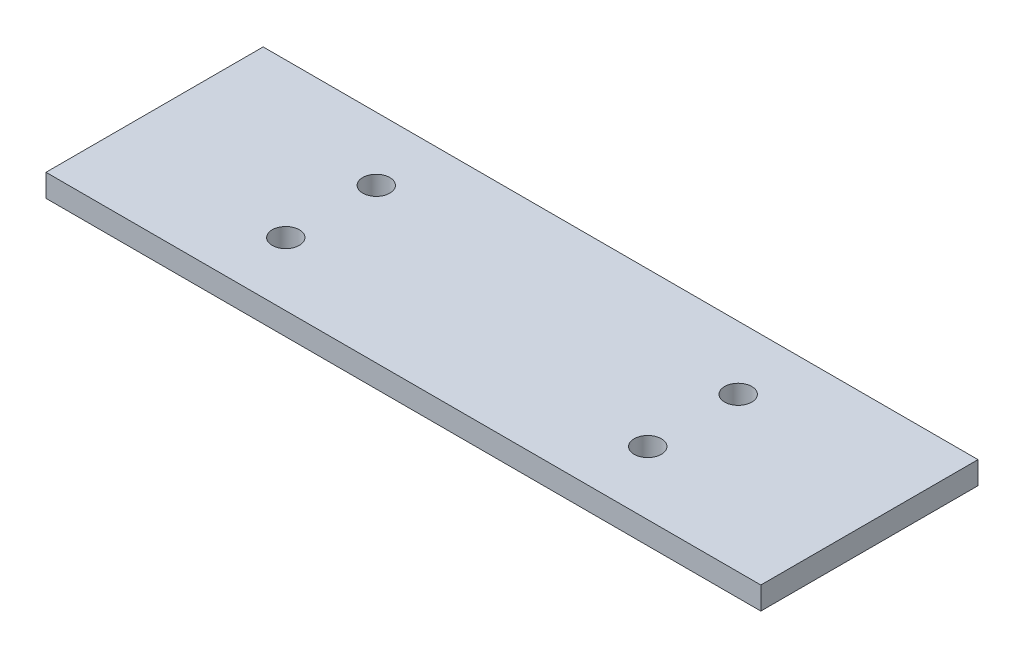
ISO-10303-21;
HEADER;
FILE_DESCRIPTION(('STEP AP214'),'2;1');
FILE_NAME('part.step','',(''),(''),'','','');
FILE_SCHEMA(('AUTOMOTIVE_DESIGN { 1 0 10303 214 1 1 1 1 }'));
ENDSEC;
DATA;
#1=APPLICATION_CONTEXT('core data for automotive mechanical design processes');
#2=APPLICATION_PROTOCOL_DEFINITION('international standard','automotive_design',2000,#1);
#3=PRODUCT_CONTEXT('',#1,'mechanical');
#4=PRODUCT('Part','Part','',(#3));
#5=PRODUCT_RELATED_PRODUCT_CATEGORY('part','',(#4));
#6=PRODUCT_DEFINITION_FORMATION('','',#4);
#7=PRODUCT_DEFINITION_CONTEXT('part definition',#1,'design');
#8=PRODUCT_DEFINITION('design','',#6,#7);
#9=PRODUCT_DEFINITION_SHAPE('','',#8);
#10=(LENGTH_UNIT() NAMED_UNIT(*) SI_UNIT(.MILLI.,.METRE.));
#11=(NAMED_UNIT(*) PLANE_ANGLE_UNIT() SI_UNIT($,.RADIAN.));
#12=(NAMED_UNIT(*) SI_UNIT($,.STERADIAN.) SOLID_ANGLE_UNIT());
#13=UNCERTAINTY_MEASURE_WITH_UNIT(LENGTH_MEASURE(1.E-05),#10,'distance_accuracy_value','');
#14=(GEOMETRIC_REPRESENTATION_CONTEXT(3) GLOBAL_UNCERTAINTY_ASSIGNED_CONTEXT((#13)) GLOBAL_UNIT_ASSIGNED_CONTEXT((#10,
#11,#12)) REPRESENTATION_CONTEXT('',''));
#15=CARTESIAN_POINT('',(0.,0.,0.));
#16=DIRECTION('',(0.,0.,1.));
#17=DIRECTION('',(1.,0.,0.));
#18=AXIS2_PLACEMENT_3D('',#15,#16,#17);
#19=CARTESIAN_POINT('',(0.,5.,0.));
#20=DIRECTION('',(0.,-1.,0.));
#21=DIRECTION('',(0.,0.,-1.));
#22=AXIS2_PLACEMENT_3D('',#19,#20,#21);
#23=PLANE('',#22);
#24=CARTESIAN_POINT('',(40.,5.,10.));
#25=DIRECTION('',(0.,1.,0.));
#26=DIRECTION('',(0.,0.,1.));
#27=AXIS2_PLACEMENT_3D('',#24,#25,#26);
#28=CIRCLE('',#27,3.);
#29=CARTESIAN_POINT('',(40.,5.,13.));
#30=VERTEX_POINT('',#29);
#31=EDGE_CURVE('E102',#30,#30,#28,.T.);
#32=ORIENTED_EDGE('',*,*,#31,.F.);
#33=EDGE_LOOP('',(#32));
#34=FACE_BOUND('',#33,.T.);
#35=CARTESIAN_POINT('',(40.,5.,-9.99999999999999));
#36=DIRECTION('',(0.,1.,0.));
#37=DIRECTION('',(0.,0.,1.));
#38=AXIS2_PLACEMENT_3D('',#35,#36,#37);
#39=CIRCLE('',#38,3.00000000000001);
#40=CARTESIAN_POINT('',(40.,5.,-6.99999999999998));
#41=VERTEX_POINT('',#40);
#42=EDGE_CURVE('E108',#41,#41,#39,.T.);
#43=ORIENTED_EDGE('',*,*,#42,.F.);
#44=EDGE_LOOP('',(#43));
#45=FACE_BOUND('',#44,.T.);
#46=CARTESIAN_POINT('',(-40.,5.,10.));
#47=DIRECTION('',(0.,1.,0.));
#48=DIRECTION('',(0.,0.,1.));
#49=AXIS2_PLACEMENT_3D('',#46,#47,#48);
#50=CIRCLE('',#49,3.00000000000001);
#51=CARTESIAN_POINT('',(-40.,5.,13.));
#52=VERTEX_POINT('',#51);
#53=EDGE_CURVE('E114',#52,#52,#50,.T.);
#54=ORIENTED_EDGE('',*,*,#53,.F.);
#55=EDGE_LOOP('',(#54));
#56=FACE_BOUND('',#55,.T.);
#57=CARTESIAN_POINT('',(-40.,5.,-9.99999999999999));
#58=DIRECTION('',(0.,1.,0.));
#59=DIRECTION('',(0.,0.,1.));
#60=AXIS2_PLACEMENT_3D('',#57,#58,#59);
#61=CIRCLE('',#60,3.00000000000001);
#62=CARTESIAN_POINT('',(-40.,5.,-6.99999999999999));
#63=VERTEX_POINT('',#62);
#64=EDGE_CURVE('E120',#63,#63,#61,.T.);
#65=ORIENTED_EDGE('',*,*,#64,.F.);
#66=EDGE_LOOP('',(#65));
#67=FACE_BOUND('',#66,.T.);
#68=DIRECTION('',(0.,0.,1.));
#69=VECTOR('',#68,1.);
#70=CARTESIAN_POINT('',(-79.,5.,-24.));
#71=LINE('',#70,#69);
#72=CARTESIAN_POINT('',(-79.,5.,-24.));
#73=VERTEX_POINT('',#72);
#74=CARTESIAN_POINT('',(-79.,5.,24.));
#75=VERTEX_POINT('',#74);
#76=EDGE_CURVE('E94',#73,#75,#71,.T.);
#77=ORIENTED_EDGE('',*,*,#76,.T.);
#78=DIRECTION('',(1.,0.,0.));
#79=VECTOR('',#78,1.);
#80=CARTESIAN_POINT('',(-79.,5.,24.));
#81=LINE('',#80,#79);
#82=CARTESIAN_POINT('',(79.,5.,24.));
#83=VERTEX_POINT('',#82);
#84=EDGE_CURVE('E92',#75,#83,#81,.T.);
#85=ORIENTED_EDGE('',*,*,#84,.T.);
#86=DIRECTION('',(0.,0.,-1.));
#87=VECTOR('',#86,1.);
#88=CARTESIAN_POINT('',(79.,5.,-24.));
#89=LINE('',#88,#87);
#90=CARTESIAN_POINT('',(79.,5.,-24.));
#91=VERTEX_POINT('',#90);
#92=EDGE_CURVE('E48',#83,#91,#89,.T.);
#93=ORIENTED_EDGE('',*,*,#92,.T.);
#94=DIRECTION('',(-1.,0.,0.));
#95=VECTOR('',#94,1.);
#96=CARTESIAN_POINT('',(-79.,5.,-24.));
#97=LINE('',#96,#95);
#98=EDGE_CURVE('E84',#91,#73,#97,.T.);
#99=ORIENTED_EDGE('',*,*,#98,.T.);
#100=EDGE_LOOP('',(#77,#85,#93,#99));
#101=FACE_BOUND('',#100,.T.);
#102=ADVANCED_FACE('F33',(#34,#45,#56,#67,#101),#23,.F.);
#103=CARTESIAN_POINT('',(0.,0.,0.));
#104=DIRECTION('',(0.,-1.,0.));
#105=DIRECTION('',(0.,0.,-1.));
#106=AXIS2_PLACEMENT_3D('',#103,#104,#105);
#107=PLANE('',#106);
#108=CARTESIAN_POINT('',(40.,0.,10.));
#109=DIRECTION('',(0.,1.,0.));
#110=DIRECTION('',(0.,0.,1.));
#111=AXIS2_PLACEMENT_3D('',#108,#109,#110);
#112=CIRCLE('',#111,3.);
#113=CARTESIAN_POINT('',(40.,0.,13.));
#114=VERTEX_POINT('',#113);
#115=EDGE_CURVE('E98',#114,#114,#112,.T.);
#116=ORIENTED_EDGE('',*,*,#115,.T.);
#117=EDGE_LOOP('',(#116));
#118=FACE_BOUND('',#117,.T.);
#119=CARTESIAN_POINT('',(-40.,0.,10.));
#120=DIRECTION('',(0.,1.,0.));
#121=DIRECTION('',(0.,0.,1.));
#122=AXIS2_PLACEMENT_3D('',#119,#120,#121);
#123=CIRCLE('',#122,3.00000000000001);
#124=CARTESIAN_POINT('',(-40.,0.,13.));
#125=VERTEX_POINT('',#124);
#126=EDGE_CURVE('E111',#125,#125,#123,.T.);
#127=ORIENTED_EDGE('',*,*,#126,.T.);
#128=EDGE_LOOP('',(#127));
#129=FACE_BOUND('',#128,.T.);
#130=CARTESIAN_POINT('',(-40.,0.,-9.99999999999999));
#131=DIRECTION('',(0.,1.,0.));
#132=DIRECTION('',(0.,0.,1.));
#133=AXIS2_PLACEMENT_3D('',#130,#131,#132);
#134=CIRCLE('',#133,3.00000000000001);
#135=CARTESIAN_POINT('',(-40.,0.,-6.99999999999999));
#136=VERTEX_POINT('',#135);
#137=EDGE_CURVE('E117',#136,#136,#134,.T.);
#138=ORIENTED_EDGE('',*,*,#137,.T.);
#139=EDGE_LOOP('',(#138));
#140=FACE_BOUND('',#139,.T.);
#141=CARTESIAN_POINT('',(40.,0.,-9.99999999999999));
#142=DIRECTION('',(0.,1.,0.));
#143=DIRECTION('',(0.,0.,1.));
#144=AXIS2_PLACEMENT_3D('',#141,#142,#143);
#145=CIRCLE('',#144,3.00000000000001);
#146=CARTESIAN_POINT('',(40.,0.,-6.99999999999998));
#147=VERTEX_POINT('',#146);
#148=EDGE_CURVE('E105',#147,#147,#145,.T.);
#149=ORIENTED_EDGE('',*,*,#148,.T.);
#150=EDGE_LOOP('',(#149));
#151=FACE_BOUND('',#150,.T.);
#152=DIRECTION('',(-1.,0.,0.));
#153=VECTOR('',#152,1.);
#154=CARTESIAN_POINT('',(0.,0.,24.));
#155=LINE('',#154,#153);
#156=CARTESIAN_POINT('',(79.,0.,24.));
#157=VERTEX_POINT('',#156);
#158=CARTESIAN_POINT('',(-79.,0.,24.));
#159=VERTEX_POINT('',#158);
#160=EDGE_CURVE('E123',#157,#159,#155,.T.);
#161=ORIENTED_EDGE('',*,*,#160,.T.);
#162=DIRECTION('',(0.,0.,-1.));
#163=VECTOR('',#162,1.);
#164=CARTESIAN_POINT('',(-79.,0.,0.));
#165=LINE('',#164,#163);
#166=CARTESIAN_POINT('',(-79.,0.,-24.));
#167=VERTEX_POINT('',#166);
#168=EDGE_CURVE('E11',#159,#167,#165,.T.);
#169=ORIENTED_EDGE('',*,*,#168,.T.);
#170=DIRECTION('',(1.,0.,0.));
#171=VECTOR('',#170,1.);
#172=CARTESIAN_POINT('',(0.,0.,-24.));
#173=LINE('',#172,#171);
#174=CARTESIAN_POINT('',(79.,0.,-24.));
#175=VERTEX_POINT('',#174);
#176=EDGE_CURVE('E41',#167,#175,#173,.T.);
#177=ORIENTED_EDGE('',*,*,#176,.T.);
#178=DIRECTION('',(0.,0.,1.));
#179=VECTOR('',#178,1.);
#180=CARTESIAN_POINT('',(79.,0.,0.));
#181=LINE('',#180,#179);
#182=EDGE_CURVE('E77',#175,#157,#181,.T.);
#183=ORIENTED_EDGE('',*,*,#182,.T.);
#184=EDGE_LOOP('',(#161,#169,#177,#183));
#185=FACE_BOUND('',#184,.T.);
#186=ADVANCED_FACE('F35',(#118,#129,#140,#151,#185),#107,.T.);
#187=CARTESIAN_POINT('',(-40.,5.,-9.99999999999999));
#188=DIRECTION('',(0.,-1.,0.));
#189=DIRECTION('',(0.,0.,-1.));
#190=AXIS2_PLACEMENT_3D('',#187,#188,#189);
#191=CYLINDRICAL_SURFACE('',#190,3.00000000000001);
#192=ORIENTED_EDGE('',*,*,#64,.T.);
#193=EDGE_LOOP('',(#192));
#194=FACE_BOUND('',#193,.T.);
#195=ORIENTED_EDGE('',*,*,#137,.F.);
#196=EDGE_LOOP('',(#195));
#197=FACE_BOUND('',#196,.T.);
#198=ADVANCED_FACE('F145',(#194,#197),#191,.F.);
#199=CARTESIAN_POINT('',(-40.,5.,10.));
#200=DIRECTION('',(0.,-1.,0.));
#201=DIRECTION('',(0.,0.,-1.));
#202=AXIS2_PLACEMENT_3D('',#199,#200,#201);
#203=CYLINDRICAL_SURFACE('',#202,3.00000000000001);
#204=ORIENTED_EDGE('',*,*,#53,.T.);
#205=EDGE_LOOP('',(#204));
#206=FACE_BOUND('',#205,.T.);
#207=ORIENTED_EDGE('',*,*,#126,.F.);
#208=EDGE_LOOP('',(#207));
#209=FACE_BOUND('',#208,.T.);
#210=ADVANCED_FACE('F152',(#206,#209),#203,.F.);
#211=CARTESIAN_POINT('',(40.,5.,-9.99999999999999));
#212=DIRECTION('',(0.,-1.,0.));
#213=DIRECTION('',(0.,0.,-1.));
#214=AXIS2_PLACEMENT_3D('',#211,#212,#213);
#215=CYLINDRICAL_SURFACE('',#214,3.00000000000001);
#216=ORIENTED_EDGE('',*,*,#42,.T.);
#217=EDGE_LOOP('',(#216));
#218=FACE_BOUND('',#217,.T.);
#219=ORIENTED_EDGE('',*,*,#148,.F.);
#220=EDGE_LOOP('',(#219));
#221=FACE_BOUND('',#220,.T.);
#222=ADVANCED_FACE('F156',(#218,#221),#215,.F.);
#223=CARTESIAN_POINT('',(40.,5.,10.));
#224=DIRECTION('',(0.,-1.,0.));
#225=DIRECTION('',(0.,0.,-1.));
#226=AXIS2_PLACEMENT_3D('',#223,#224,#225);
#227=CYLINDRICAL_SURFACE('',#226,3.);
#228=ORIENTED_EDGE('',*,*,#31,.T.);
#229=EDGE_LOOP('',(#228));
#230=FACE_BOUND('',#229,.T.);
#231=ORIENTED_EDGE('',*,*,#115,.F.);
#232=EDGE_LOOP('',(#231));
#233=FACE_BOUND('',#232,.T.);
#234=ADVANCED_FACE('F160',(#230,#233),#227,.F.);
#235=CARTESIAN_POINT('',(-79.,-5.,-24.));
#236=DIRECTION('',(-1.,0.,0.));
#237=DIRECTION('',(0.,0.,1.));
#238=AXIS2_PLACEMENT_3D('',#235,#236,#237);
#239=PLANE('',#238);
#240=DIRECTION('',(0.,1.,0.));
#241=VECTOR('',#240,1.);
#242=CARTESIAN_POINT('',(-79.,-5.,24.));
#243=LINE('',#242,#241);
#244=EDGE_CURVE('E56',#159,#75,#243,.T.);
#245=ORIENTED_EDGE('',*,*,#244,.T.);
#246=ORIENTED_EDGE('',*,*,#76,.F.);
#247=DIRECTION('',(0.,1.,0.));
#248=VECTOR('',#247,1.);
#249=CARTESIAN_POINT('',(-79.,-5.,-24.));
#250=LINE('',#249,#248);
#251=EDGE_CURVE('E80',#167,#73,#250,.T.);
#252=ORIENTED_EDGE('',*,*,#251,.F.);
#253=ORIENTED_EDGE('',*,*,#168,.F.);
#254=EDGE_LOOP('',(#245,#246,#252,#253));
#255=FACE_BOUND('',#254,.T.);
#256=ADVANCED_FACE('F130',(#255),#239,.T.);
#257=CARTESIAN_POINT('',(-79.,-5.,-24.));
#258=DIRECTION('',(0.,0.,-1.));
#259=DIRECTION('',(-1.,0.,0.));
#260=AXIS2_PLACEMENT_3D('',#257,#258,#259);
#261=PLANE('',#260);
#262=ORIENTED_EDGE('',*,*,#251,.T.);
#263=ORIENTED_EDGE('',*,*,#98,.F.);
#264=DIRECTION('',(0.,1.,0.));
#265=VECTOR('',#264,1.);
#266=CARTESIAN_POINT('',(79.,-5.,-24.));
#267=LINE('',#266,#265);
#268=EDGE_CURVE('E73',#175,#91,#267,.T.);
#269=ORIENTED_EDGE('',*,*,#268,.F.);
#270=ORIENTED_EDGE('',*,*,#176,.F.);
#271=EDGE_LOOP('',(#262,#263,#269,#270));
#272=FACE_BOUND('',#271,.T.);
#273=ADVANCED_FACE('F85',(#272),#261,.T.);
#274=CARTESIAN_POINT('',(79.,-5.,-24.));
#275=DIRECTION('',(1.,0.,0.));
#276=DIRECTION('',(0.,0.,-1.));
#277=AXIS2_PLACEMENT_3D('',#274,#275,#276);
#278=PLANE('',#277);
#279=ORIENTED_EDGE('',*,*,#268,.T.);
#280=ORIENTED_EDGE('',*,*,#92,.F.);
#281=DIRECTION('',(0.,1.,0.));
#282=VECTOR('',#281,1.);
#283=CARTESIAN_POINT('',(79.,-5.,24.));
#284=LINE('',#283,#282);
#285=EDGE_CURVE('E81',#157,#83,#284,.T.);
#286=ORIENTED_EDGE('',*,*,#285,.F.);
#287=ORIENTED_EDGE('',*,*,#182,.F.);
#288=EDGE_LOOP('',(#279,#280,#286,#287));
#289=FACE_BOUND('',#288,.T.);
#290=ADVANCED_FACE('F75',(#289),#278,.T.);
#291=CARTESIAN_POINT('',(-79.,-5.,24.));
#292=DIRECTION('',(0.,0.,1.));
#293=DIRECTION('',(1.,0.,0.));
#294=AXIS2_PLACEMENT_3D('',#291,#292,#293);
#295=PLANE('',#294);
#296=ORIENTED_EDGE('',*,*,#285,.T.);
#297=ORIENTED_EDGE('',*,*,#84,.F.);
#298=ORIENTED_EDGE('',*,*,#244,.F.);
#299=ORIENTED_EDGE('',*,*,#160,.F.);
#300=EDGE_LOOP('',(#296,#297,#298,#299));
#301=FACE_BOUND('',#300,.T.);
#302=ADVANCED_FACE('F131',(#301),#295,.T.);
#303=CLOSED_SHELL('',(#102,#186,#198,#210,#222,#234,#256,#273,#290,#302));
#304=MANIFOLD_SOLID_BREP('B2',#303);
#305=ADVANCED_BREP_SHAPE_REPRESENTATION('',(#18,#304),#14);
#306=SHAPE_DEFINITION_REPRESENTATION(#9,#305);
ENDSEC;
END-ISO-10303-21;
